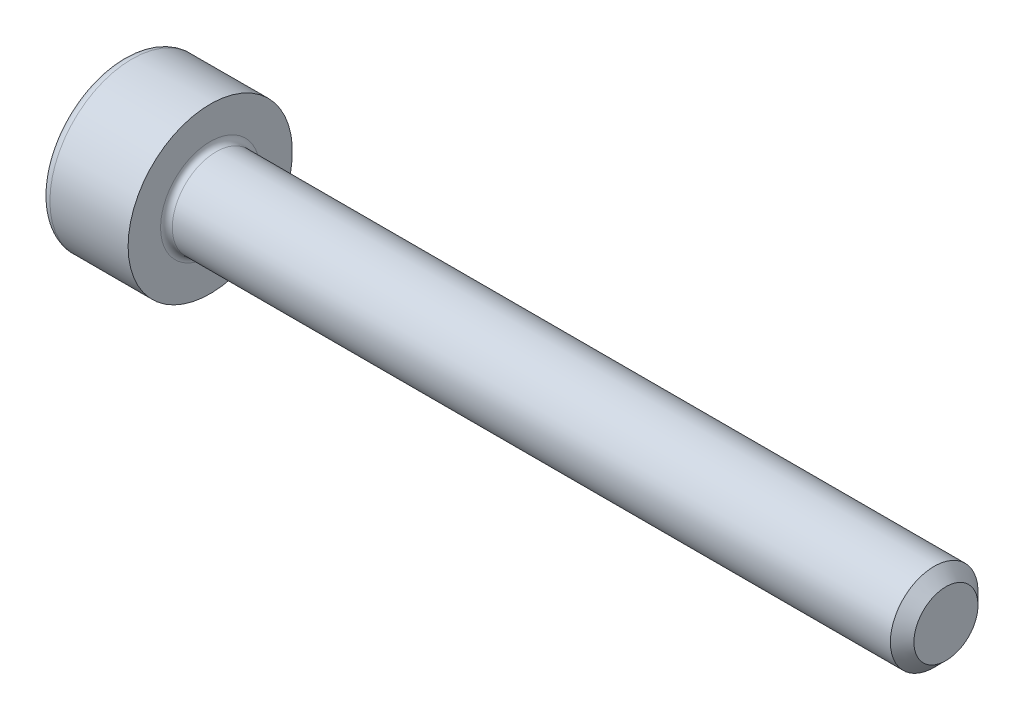
ISO-10303-21;
HEADER;
FILE_DESCRIPTION(('STEP AP214'),'2;1');
FILE_NAME('part.step','',(''),(''),'','','');
FILE_SCHEMA(('AUTOMOTIVE_DESIGN { 1 0 10303 214 1 1 1 1 }'));
ENDSEC;
DATA;
#1=APPLICATION_CONTEXT('core data for automotive mechanical design processes');
#2=APPLICATION_PROTOCOL_DEFINITION('international standard','automotive_design',2000,#1);
#3=PRODUCT_CONTEXT('',#1,'mechanical');
#4=PRODUCT('Part','Part','',(#3));
#5=PRODUCT_RELATED_PRODUCT_CATEGORY('part','',(#4));
#6=PRODUCT_DEFINITION_FORMATION('','',#4);
#7=PRODUCT_DEFINITION_CONTEXT('part definition',#1,'design');
#8=PRODUCT_DEFINITION('design','',#6,#7);
#9=PRODUCT_DEFINITION_SHAPE('','',#8);
#10=(LENGTH_UNIT() NAMED_UNIT(*) SI_UNIT(.MILLI.,.METRE.));
#11=(NAMED_UNIT(*) PLANE_ANGLE_UNIT() SI_UNIT($,.RADIAN.));
#12=(NAMED_UNIT(*) SI_UNIT($,.STERADIAN.) SOLID_ANGLE_UNIT());
#13=UNCERTAINTY_MEASURE_WITH_UNIT(LENGTH_MEASURE(1.E-05),#10,'distance_accuracy_value','');
#14=(GEOMETRIC_REPRESENTATION_CONTEXT(3) GLOBAL_UNCERTAINTY_ASSIGNED_CONTEXT((#13)) GLOBAL_UNIT_ASSIGNED_CONTEXT((#10,
#11,#12)) REPRESENTATION_CONTEXT('',''));
#15=CARTESIAN_POINT('',(0.,0.,0.));
#16=DIRECTION('',(0.,0.,1.));
#17=DIRECTION('',(1.,0.,0.));
#18=AXIS2_PLACEMENT_3D('',#15,#16,#17);
#19=CARTESIAN_POINT('',(0.,0.,0.));
#20=DIRECTION('',(-1.,0.,0.));
#21=DIRECTION('',(0.,0.,1.));
#22=AXIS2_PLACEMENT_3D('',#19,#20,#21);
#23=CYLINDRICAL_SURFACE('',#22,1.39568824458778);
#24=CARTESIAN_POINT('',(0.16,0.,0.));
#25=DIRECTION('',(1.,0.,0.));
#26=DIRECTION('',(0.,0.,-1.));
#27=AXIS2_PLACEMENT_3D('',#24,#25,#26);
#28=CIRCLE('',#27,1.39568824458778);
#29=CARTESIAN_POINT('',(0.16,0.,-1.39568824458778));
#30=VERTEX_POINT('',#29);
#31=EDGE_CURVE('E158',#30,#30,#28,.T.);
#32=ORIENTED_EDGE('',*,*,#31,.T.);
#33=EDGE_LOOP('',(#32));
#34=FACE_BOUND('',#33,.T.);
#35=CARTESIAN_POINT('',(1.48873412756029,0.,0.));
#36=DIRECTION('',(-1.,0.,0.));
#37=DIRECTION('',(0.,0.,1.));
#38=AXIS2_PLACEMENT_3D('',#35,#36,#37);
#39=CIRCLE('',#38,1.39568824458778);
#40=CARTESIAN_POINT('',(1.48873412756029,0.,1.39568824458778));
#41=VERTEX_POINT('',#40);
#42=EDGE_CURVE('E141',#41,#41,#39,.T.);
#43=ORIENTED_EDGE('',*,*,#42,.T.);
#44=EDGE_LOOP('',(#43));
#45=FACE_BOUND('',#44,.T.);
#46=ADVANCED_FACE('F39',(#34,#45),#23,.T.);
#47=CARTESIAN_POINT('',(0.,0.,0.));
#48=DIRECTION('',(1.,0.,0.));
#49=DIRECTION('',(0.,0.,-1.));
#50=AXIS2_PLACEMENT_3D('',#47,#48,#49);
#51=PLANE('',#50);
#52=DIRECTION('',(0.,-0.5,-0.866025403784439));
#53=VECTOR('',#52,1.);
#54=CARTESIAN_POINT('',(0.,0.877572409168232,0.));
#55=LINE('',#54,#53);
#56=CARTESIAN_POINT('',(0.,0.877572409168232,0.));
#57=VERTEX_POINT('',#56);
#58=CARTESIAN_POINT('',(0.,0.438786204584116,-0.760000000000001));
#59=VERTEX_POINT('',#58);
#60=EDGE_CURVE('E128',#57,#59,#55,.T.);
#61=ORIENTED_EDGE('',*,*,#60,.F.);
#62=DIRECTION('',(0.,0.5,-0.866025403784439));
#63=VECTOR('',#62,1.);
#64=CARTESIAN_POINT('',(0.,0.438786204584116,0.76));
#65=LINE('',#64,#63);
#66=CARTESIAN_POINT('',(0.,0.438786204584116,0.76));
#67=VERTEX_POINT('',#66);
#68=EDGE_CURVE('E54',#67,#57,#65,.T.);
#69=ORIENTED_EDGE('',*,*,#68,.F.);
#70=DIRECTION('',(0.,1.,0.));
#71=VECTOR('',#70,1.);
#72=CARTESIAN_POINT('',(0.,-0.438786204584116,0.76));
#73=LINE('',#72,#71);
#74=CARTESIAN_POINT('',(0.,-0.438786204584116,0.76));
#75=VERTEX_POINT('',#74);
#76=EDGE_CURVE('E137',#75,#67,#73,.T.);
#77=ORIENTED_EDGE('',*,*,#76,.F.);
#78=DIRECTION('',(0.,0.5,0.866025403784439));
#79=VECTOR('',#78,1.);
#80=CARTESIAN_POINT('',(0.,-0.877572409168232,0.));
#81=LINE('',#80,#79);
#82=CARTESIAN_POINT('',(0.,-0.877572409168232,0.));
#83=VERTEX_POINT('',#82);
#84=EDGE_CURVE('E135',#83,#75,#81,.T.);
#85=ORIENTED_EDGE('',*,*,#84,.F.);
#86=DIRECTION('',(0.,-0.5,0.866025403784438));
#87=VECTOR('',#86,1.);
#88=CARTESIAN_POINT('',(0.,-0.438786204584116,-0.760000000000001));
#89=LINE('',#88,#87);
#90=CARTESIAN_POINT('',(0.,-0.438786204584116,-0.760000000000001));
#91=VERTEX_POINT('',#90);
#92=EDGE_CURVE('E102',#91,#83,#89,.T.);
#93=ORIENTED_EDGE('',*,*,#92,.F.);
#94=DIRECTION('',(0.,-1.,0.));
#95=VECTOR('',#94,1.);
#96=CARTESIAN_POINT('',(0.,0.438786204584116,-0.760000000000001));
#97=LINE('',#96,#95);
#98=EDGE_CURVE('E131',#59,#91,#97,.T.);
#99=ORIENTED_EDGE('',*,*,#98,.F.);
#100=EDGE_LOOP('',(#61,#69,#77,#85,#93,#99));
#101=FACE_BOUND('',#100,.T.);
#102=CARTESIAN_POINT('',(0.,0.,0.));
#103=DIRECTION('',(1.,0.,0.));
#104=DIRECTION('',(0.,0.,-1.));
#105=AXIS2_PLACEMENT_3D('',#102,#103,#104);
#106=CIRCLE('',#105,1.23568824458778);
#107=CARTESIAN_POINT('',(0.,0.,-1.23568824458778));
#108=VERTEX_POINT('',#107);
#109=EDGE_CURVE('E155',#108,#108,#106,.F.);
#110=ORIENTED_EDGE('',*,*,#109,.T.);
#111=EDGE_LOOP('',(#110));
#112=FACE_BOUND('',#111,.T.);
#113=ADVANCED_FACE('F180',(#101,#112),#51,.F.);
#114=CARTESIAN_POINT('',(13.9887341275603,0.,0.));
#115=DIRECTION('',(-1.,0.,0.));
#116=DIRECTION('',(0.,0.,1.));
#117=AXIS2_PLACEMENT_3D('',#114,#115,#116);
#118=PLANE('',#117);
#119=CARTESIAN_POINT('',(13.9887341275603,0.,0.));
#120=DIRECTION('',(-1.,0.,0.));
#121=DIRECTION('',(0.,0.,1.));
#122=AXIS2_PLACEMENT_3D('',#119,#120,#121);
#123=CIRCLE('',#122,0.544367063780147);
#124=CARTESIAN_POINT('',(13.9887341275603,0.,0.544367063780147));
#125=VERTEX_POINT('',#124);
#126=EDGE_CURVE('E11',#125,#125,#123,.F.);
#127=ORIENTED_EDGE('',*,*,#126,.T.);
#128=EDGE_LOOP('',(#127));
#129=FACE_BOUND('',#128,.T.);
#130=ADVANCED_FACE('F186',(#129),#118,.F.);
#131=CARTESIAN_POINT('',(0.,0.,0.));
#132=DIRECTION('',(-1.,0.,0.));
#133=DIRECTION('',(0.,0.,1.));
#134=AXIS2_PLACEMENT_3D('',#131,#132,#133);
#135=CYLINDRICAL_SURFACE('',#134,0.744367063780147);
#136=CARTESIAN_POINT('',(13.7887341275603,0.,0.));
#137=DIRECTION('',(-1.,0.,0.));
#138=DIRECTION('',(0.,0.,1.));
#139=AXIS2_PLACEMENT_3D('',#136,#137,#138);
#140=CIRCLE('',#139,0.744367063780147);
#141=CARTESIAN_POINT('',(13.7887341275603,0.,0.744367063780147));
#142=VERTEX_POINT('',#141);
#143=EDGE_CURVE('E47',#142,#142,#140,.T.);
#144=ORIENTED_EDGE('',*,*,#143,.T.);
#145=EDGE_LOOP('',(#144));
#146=FACE_BOUND('',#145,.T.);
#147=CARTESIAN_POINT('',(1.58873412756029,0.,0.));
#148=DIRECTION('',(-1.,0.,0.));
#149=DIRECTION('',(0.,0.,1.));
#150=AXIS2_PLACEMENT_3D('',#147,#148,#149);
#151=CIRCLE('',#150,0.744367063780147);
#152=CARTESIAN_POINT('',(1.58873412756029,0.,0.744367063780147));
#153=VERTEX_POINT('',#152);
#154=EDGE_CURVE('E152',#153,#153,#151,.F.);
#155=ORIENTED_EDGE('',*,*,#154,.T.);
#156=EDGE_LOOP('',(#155));
#157=FACE_BOUND('',#156,.T.);
#158=ADVANCED_FACE('F163',(#146,#157),#135,.T.);
#159=CARTESIAN_POINT('',(1.48873412756029,0.,0.));
#160=DIRECTION('',(-1.,0.,0.));
#161=DIRECTION('',(0.,0.,1.));
#162=AXIS2_PLACEMENT_3D('',#159,#160,#161);
#163=PLANE('',#162);
#164=CARTESIAN_POINT('',(1.48873412756029,0.,0.));
#165=DIRECTION('',(-1.,0.,0.));
#166=DIRECTION('',(0.,0.,1.));
#167=AXIS2_PLACEMENT_3D('',#164,#165,#166);
#168=CIRCLE('',#167,0.844367063780147);
#169=CARTESIAN_POINT('',(1.48873412756029,0.,0.844367063780147));
#170=VERTEX_POINT('',#169);
#171=EDGE_CURVE('E149',#170,#170,#168,.T.);
#172=ORIENTED_EDGE('',*,*,#171,.T.);
#173=EDGE_LOOP('',(#172));
#174=FACE_BOUND('',#173,.T.);
#175=ORIENTED_EDGE('',*,*,#42,.F.);
#176=EDGE_LOOP('',(#175));
#177=FACE_BOUND('',#176,.T.);
#178=ADVANCED_FACE('F193',(#174,#177),#163,.F.);
#179=CARTESIAN_POINT('',(1.58873412756029,0.,0.));
#180=DIRECTION('',(-1.,0.,0.));
#181=DIRECTION('',(0.,0.,1.));
#182=AXIS2_PLACEMENT_3D('',#179,#180,#181);
#183=TOROIDAL_SURFACE('',#182,0.844367063780147,0.1);
#184=ORIENTED_EDGE('',*,*,#154,.F.);
#185=EDGE_LOOP('',(#184));
#186=FACE_BOUND('',#185,.T.);
#187=ORIENTED_EDGE('',*,*,#171,.F.);
#188=EDGE_LOOP('',(#187));
#189=FACE_BOUND('',#188,.T.);
#190=ADVANCED_FACE('F176',(#186,#189),#183,.F.);
#191=CARTESIAN_POINT('',(0.16,0.,0.));
#192=DIRECTION('',(1.,0.,0.));
#193=DIRECTION('',(0.,0.,-1.));
#194=AXIS2_PLACEMENT_3D('',#191,#192,#193);
#195=TOROIDAL_SURFACE('',#194,1.23568824458778,0.16);
#196=ORIENTED_EDGE('',*,*,#31,.F.);
#197=EDGE_LOOP('',(#196));
#198=FACE_BOUND('',#197,.T.);
#199=ORIENTED_EDGE('',*,*,#109,.F.);
#200=EDGE_LOOP('',(#199));
#201=FACE_BOUND('',#200,.T.);
#202=ADVANCED_FACE('F168',(#198,#201),#195,.T.);
#203=CARTESIAN_POINT('',(13.7887341275603,0.,0.));
#204=DIRECTION('',(-1.,0.,0.));
#205=DIRECTION('',(0.,0.,1.));
#206=AXIS2_PLACEMENT_3D('',#203,#204,#205);
#207=CONICAL_SURFACE('',#206,0.744367063780147,0.785398163397453);
#208=ORIENTED_EDGE('',*,*,#126,.F.);
#209=EDGE_LOOP('',(#208));
#210=FACE_BOUND('',#209,.T.);
#211=ORIENTED_EDGE('',*,*,#143,.F.);
#212=EDGE_LOOP('',(#211));
#213=FACE_BOUND('',#212,.T.);
#214=ADVANCED_FACE('F41',(#210,#213),#207,.T.);
#215=CARTESIAN_POINT('',(0.7,0.438786204584116,0.76));
#216=DIRECTION('',(0.,0.866025403784439,0.5));
#217=DIRECTION('',(0.,-0.5,0.866025403784439));
#218=AXIS2_PLACEMENT_3D('',#215,#216,#217);
#219=PLANE('',#218);
#220=ORIENTED_EDGE('',*,*,#68,.T.);
#221=DIRECTION('',(-1.,0.,0.));
#222=VECTOR('',#221,1.);
#223=CARTESIAN_POINT('',(0.7,0.877572409168232,0.));
#224=LINE('',#223,#222);
#225=CARTESIAN_POINT('',(0.7,0.877572409168232,0.));
#226=VERTEX_POINT('',#225);
#227=EDGE_CURVE('E84',#226,#57,#224,.T.);
#228=ORIENTED_EDGE('',*,*,#227,.F.);
#229=DIRECTION('',(0.,0.5,-0.866025403784439));
#230=VECTOR('',#229,1.);
#231=CARTESIAN_POINT('',(0.7,0.438786204584116,0.76));
#232=LINE('',#231,#230);
#233=CARTESIAN_POINT('',(0.7,0.438786204584116,0.76));
#234=VERTEX_POINT('',#233);
#235=EDGE_CURVE('E139',#234,#226,#232,.T.);
#236=ORIENTED_EDGE('',*,*,#235,.F.);
#237=DIRECTION('',(-1.,0.,0.));
#238=VECTOR('',#237,1.);
#239=CARTESIAN_POINT('',(0.7,0.438786204584116,0.76));
#240=LINE('',#239,#238);
#241=EDGE_CURVE('E62',#234,#67,#240,.T.);
#242=ORIENTED_EDGE('',*,*,#241,.T.);
#243=EDGE_LOOP('',(#220,#228,#236,#242));
#244=FACE_BOUND('',#243,.T.);
#245=ADVANCED_FACE('F167',(#244),#219,.F.);
#246=CARTESIAN_POINT('',(0.7,-0.438786204584116,0.76));
#247=DIRECTION('',(0.,0.,1.));
#248=DIRECTION('',(1.,0.,0.));
#249=AXIS2_PLACEMENT_3D('',#246,#247,#248);
#250=PLANE('',#249);
#251=ORIENTED_EDGE('',*,*,#76,.T.);
#252=ORIENTED_EDGE('',*,*,#241,.F.);
#253=DIRECTION('',(0.,1.,0.));
#254=VECTOR('',#253,1.);
#255=CARTESIAN_POINT('',(0.7,-0.438786204584116,0.76));
#256=LINE('',#255,#254);
#257=CARTESIAN_POINT('',(0.7,-0.438786204584116,0.76));
#258=VERTEX_POINT('',#257);
#259=EDGE_CURVE('E114',#258,#234,#256,.T.);
#260=ORIENTED_EDGE('',*,*,#259,.F.);
#261=DIRECTION('',(-1.,0.,0.));
#262=VECTOR('',#261,1.);
#263=CARTESIAN_POINT('',(0.7,-0.438786204584116,0.76));
#264=LINE('',#263,#262);
#265=EDGE_CURVE('E106',#258,#75,#264,.T.);
#266=ORIENTED_EDGE('',*,*,#265,.T.);
#267=EDGE_LOOP('',(#251,#252,#260,#266));
#268=FACE_BOUND('',#267,.T.);
#269=ADVANCED_FACE('F174',(#268),#250,.F.);
#270=CARTESIAN_POINT('',(0.7,-0.877572409168232,0.));
#271=DIRECTION('',(0.,-0.866025403784439,0.5));
#272=DIRECTION('',(0.,-0.5,-0.866025403784439));
#273=AXIS2_PLACEMENT_3D('',#270,#271,#272);
#274=PLANE('',#273);
#275=ORIENTED_EDGE('',*,*,#84,.T.);
#276=ORIENTED_EDGE('',*,*,#265,.F.);
#277=DIRECTION('',(0.,0.5,0.866025403784439));
#278=VECTOR('',#277,1.);
#279=CARTESIAN_POINT('',(0.7,-0.877572409168232,0.));
#280=LINE('',#279,#278);
#281=CARTESIAN_POINT('',(0.7,-0.877572409168232,0.));
#282=VERTEX_POINT('',#281);
#283=EDGE_CURVE('E110',#282,#258,#280,.T.);
#284=ORIENTED_EDGE('',*,*,#283,.F.);
#285=DIRECTION('',(-1.,0.,0.));
#286=VECTOR('',#285,1.);
#287=CARTESIAN_POINT('',(0.7,-0.877572409168232,0.));
#288=LINE('',#287,#286);
#289=EDGE_CURVE('E95',#282,#83,#288,.T.);
#290=ORIENTED_EDGE('',*,*,#289,.T.);
#291=EDGE_LOOP('',(#275,#276,#284,#290));
#292=FACE_BOUND('',#291,.T.);
#293=ADVANCED_FACE('F111',(#292),#274,.F.);
#294=CARTESIAN_POINT('',(0.7,-0.438786204584116,-0.760000000000001));
#295=DIRECTION('',(0.,-0.866025403784438,-0.5));
#296=DIRECTION('',(0.,0.5,-0.866025403784438));
#297=AXIS2_PLACEMENT_3D('',#294,#295,#296);
#298=PLANE('',#297);
#299=ORIENTED_EDGE('',*,*,#92,.T.);
#300=ORIENTED_EDGE('',*,*,#289,.F.);
#301=DIRECTION('',(0.,-0.5,0.866025403784438));
#302=VECTOR('',#301,1.);
#303=CARTESIAN_POINT('',(0.7,-0.438786204584116,-0.760000000000001));
#304=LINE('',#303,#302);
#305=CARTESIAN_POINT('',(0.7,-0.438786204584116,-0.760000000000001));
#306=VERTEX_POINT('',#305);
#307=EDGE_CURVE('E99',#306,#282,#304,.T.);
#308=ORIENTED_EDGE('',*,*,#307,.F.);
#309=DIRECTION('',(-1.,0.,0.));
#310=VECTOR('',#309,1.);
#311=CARTESIAN_POINT('',(0.7,-0.438786204584116,-0.760000000000001));
#312=LINE('',#311,#310);
#313=EDGE_CURVE('E107',#306,#91,#312,.T.);
#314=ORIENTED_EDGE('',*,*,#313,.T.);
#315=EDGE_LOOP('',(#299,#300,#308,#314));
#316=FACE_BOUND('',#315,.T.);
#317=ADVANCED_FACE('F97',(#316),#298,.F.);
#318=CARTESIAN_POINT('',(0.7,0.438786204584116,-0.760000000000001));
#319=DIRECTION('',(0.,0.,-1.));
#320=DIRECTION('',(0.,1.,0.));
#321=AXIS2_PLACEMENT_3D('',#318,#319,#320);
#322=PLANE('',#321);
#323=ORIENTED_EDGE('',*,*,#98,.T.);
#324=ORIENTED_EDGE('',*,*,#313,.F.);
#325=DIRECTION('',(0.,-1.,0.));
#326=VECTOR('',#325,1.);
#327=CARTESIAN_POINT('',(0.7,0.438786204584116,-0.760000000000001));
#328=LINE('',#327,#326);
#329=CARTESIAN_POINT('',(0.7,0.438786204584116,-0.760000000000001));
#330=VERTEX_POINT('',#329);
#331=EDGE_CURVE('E120',#330,#306,#328,.T.);
#332=ORIENTED_EDGE('',*,*,#331,.F.);
#333=DIRECTION('',(-1.,0.,0.));
#334=VECTOR('',#333,1.);
#335=CARTESIAN_POINT('',(0.7,0.438786204584116,-0.760000000000001));
#336=LINE('',#335,#334);
#337=EDGE_CURVE('E144',#330,#59,#336,.T.);
#338=ORIENTED_EDGE('',*,*,#337,.T.);
#339=EDGE_LOOP('',(#323,#324,#332,#338));
#340=FACE_BOUND('',#339,.T.);
#341=ADVANCED_FACE('F215',(#340),#322,.F.);
#342=CARTESIAN_POINT('',(0.7,0.877572409168232,0.));
#343=DIRECTION('',(0.,0.866025403784439,-0.5));
#344=DIRECTION('',(0.,0.5,0.866025403784439));
#345=AXIS2_PLACEMENT_3D('',#342,#343,#344);
#346=PLANE('',#345);
#347=ORIENTED_EDGE('',*,*,#60,.T.);
#348=ORIENTED_EDGE('',*,*,#337,.F.);
#349=DIRECTION('',(0.,-0.5,-0.866025403784439));
#350=VECTOR('',#349,1.);
#351=CARTESIAN_POINT('',(0.7,0.877572409168232,0.));
#352=LINE('',#351,#350);
#353=EDGE_CURVE('E122',#226,#330,#352,.T.);
#354=ORIENTED_EDGE('',*,*,#353,.F.);
#355=ORIENTED_EDGE('',*,*,#227,.T.);
#356=EDGE_LOOP('',(#347,#348,#354,#355));
#357=FACE_BOUND('',#356,.T.);
#358=ADVANCED_FACE('F212',(#357),#346,.F.);
#359=CARTESIAN_POINT('',(0.7,0.,0.));
#360=DIRECTION('',(-1.,0.,0.));
#361=DIRECTION('',(0.,0.,1.));
#362=AXIS2_PLACEMENT_3D('',#359,#360,#361);
#363=PLANE('',#362);
#364=ORIENTED_EDGE('',*,*,#235,.T.);
#365=ORIENTED_EDGE('',*,*,#353,.T.);
#366=ORIENTED_EDGE('',*,*,#331,.T.);
#367=ORIENTED_EDGE('',*,*,#307,.T.);
#368=ORIENTED_EDGE('',*,*,#283,.T.);
#369=ORIENTED_EDGE('',*,*,#259,.T.);
#370=EDGE_LOOP('',(#364,#365,#366,#367,#368,#369));
#371=FACE_BOUND('',#370,.T.);
#372=ADVANCED_FACE('F117',(#371),#363,.T.);
#373=CLOSED_SHELL('',(#46,#113,#130,#158,#178,#190,#202,#214,#245,#269,#293,#317,#341,#358,#372));
#374=MANIFOLD_SOLID_BREP('B2',#373);
#375=ADVANCED_BREP_SHAPE_REPRESENTATION('',(#18,#374),#14);
#376=SHAPE_DEFINITION_REPRESENTATION(#9,#375);
ENDSEC;
END-ISO-10303-21;
